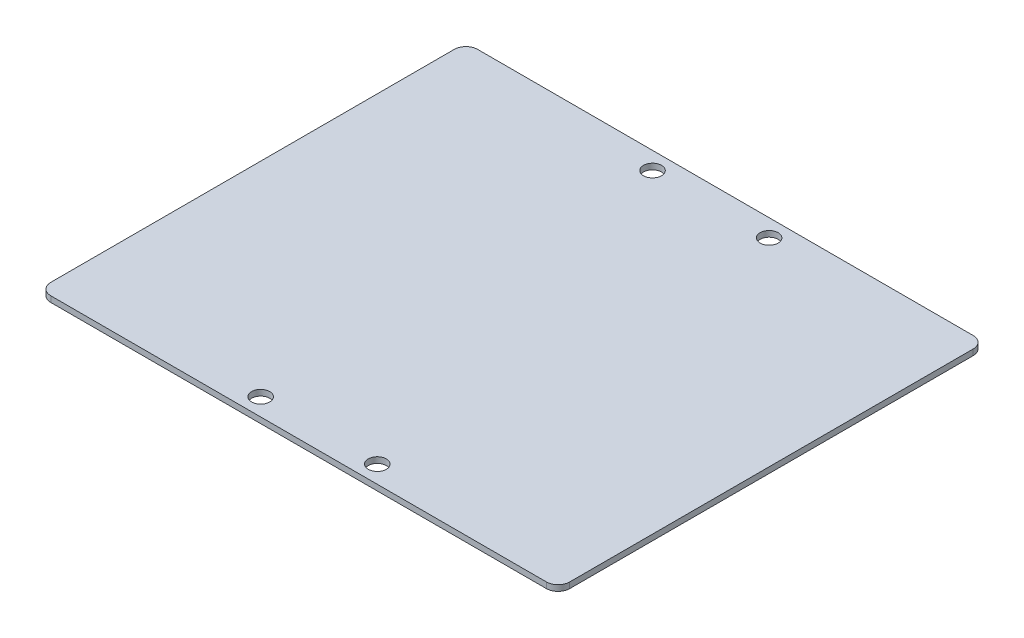
ISO-10303-21;
HEADER;
FILE_DESCRIPTION(('STEP AP214'),'2;1');
FILE_NAME('part.step','',(''),(''),'','','');
FILE_SCHEMA(('AUTOMOTIVE_DESIGN { 1 0 10303 214 1 1 1 1 }'));
ENDSEC;
DATA;
#1=APPLICATION_CONTEXT('core data for automotive mechanical design processes');
#2=APPLICATION_PROTOCOL_DEFINITION('international standard','automotive_design',2000,#1);
#3=PRODUCT_CONTEXT('',#1,'mechanical');
#4=PRODUCT('Part','Part','',(#3));
#5=PRODUCT_RELATED_PRODUCT_CATEGORY('part','',(#4));
#6=PRODUCT_DEFINITION_FORMATION('','',#4);
#7=PRODUCT_DEFINITION_CONTEXT('part definition',#1,'design');
#8=PRODUCT_DEFINITION('design','',#6,#7);
#9=PRODUCT_DEFINITION_SHAPE('','',#8);
#10=(LENGTH_UNIT() NAMED_UNIT(*) SI_UNIT(.MILLI.,.METRE.));
#11=(NAMED_UNIT(*) PLANE_ANGLE_UNIT() SI_UNIT($,.RADIAN.));
#12=(NAMED_UNIT(*) SI_UNIT($,.STERADIAN.) SOLID_ANGLE_UNIT());
#13=UNCERTAINTY_MEASURE_WITH_UNIT(LENGTH_MEASURE(1.E-05),#10,'distance_accuracy_value','');
#14=(GEOMETRIC_REPRESENTATION_CONTEXT(3) GLOBAL_UNCERTAINTY_ASSIGNED_CONTEXT((#13)) GLOBAL_UNIT_ASSIGNED_CONTEXT((#10,
#11,#12)) REPRESENTATION_CONTEXT('',''));
#15=CARTESIAN_POINT('',(0.,0.,0.));
#16=DIRECTION('',(0.,0.,1.));
#17=DIRECTION('',(1.,0.,0.));
#18=AXIS2_PLACEMENT_3D('',#15,#16,#17);
#19=CARTESIAN_POINT('',(44.5,1.,-36.6));
#20=DIRECTION('',(-1.,0.,0.));
#21=DIRECTION('',(0.,0.,1.));
#22=AXIS2_PLACEMENT_3D('',#19,#20,#21);
#23=PLANE('',#22);
#24=DIRECTION('',(0.,0.,-1.));
#25=VECTOR('',#24,1.);
#26=CARTESIAN_POINT('',(44.5,1.,-36.6));
#27=LINE('',#26,#25);
#28=CARTESIAN_POINT('',(44.5,1.,34.6));
#29=VERTEX_POINT('',#28);
#30=CARTESIAN_POINT('',(44.5,1.,-34.6));
#31=VERTEX_POINT('',#30);
#32=EDGE_CURVE('E123',#29,#31,#27,.T.);
#33=ORIENTED_EDGE('',*,*,#32,.F.);
#34=DIRECTION('',(0.,-1.,0.));
#35=VECTOR('',#34,1.);
#36=CARTESIAN_POINT('',(44.5,1.,34.6));
#37=LINE('',#36,#35);
#38=CARTESIAN_POINT('',(44.5,0.,34.6));
#39=VERTEX_POINT('',#38);
#40=EDGE_CURVE('E108',#29,#39,#37,.T.);
#41=ORIENTED_EDGE('',*,*,#40,.T.);
#42=DIRECTION('',(0.,0.,-1.));
#43=VECTOR('',#42,1.);
#44=CARTESIAN_POINT('',(44.5,0.,-36.6));
#45=LINE('',#44,#43);
#46=CARTESIAN_POINT('',(44.5,0.,-34.6));
#47=VERTEX_POINT('',#46);
#48=EDGE_CURVE('E120',#39,#47,#45,.T.);
#49=ORIENTED_EDGE('',*,*,#48,.T.);
#50=DIRECTION('',(0.,-1.,0.));
#51=VECTOR('',#50,1.);
#52=CARTESIAN_POINT('',(44.5,1.,-34.6));
#53=LINE('',#52,#51);
#54=EDGE_CURVE('E125',#47,#31,#53,.F.);
#55=ORIENTED_EDGE('',*,*,#54,.T.);
#56=EDGE_LOOP('',(#33,#41,#49,#55));
#57=FACE_BOUND('',#56,.T.);
#58=ADVANCED_FACE('F38',(#57),#23,.F.);
#59=CARTESIAN_POINT('',(-44.5,1.,-36.6));
#60=DIRECTION('',(0.,0.,1.));
#61=DIRECTION('',(1.,0.,0.));
#62=AXIS2_PLACEMENT_3D('',#59,#60,#61);
#63=PLANE('',#62);
#64=DIRECTION('',(-1.,0.,0.));
#65=VECTOR('',#64,1.);
#66=CARTESIAN_POINT('',(-44.5,0.,-36.6));
#67=LINE('',#66,#65);
#68=CARTESIAN_POINT('',(42.5,0.,-36.6));
#69=VERTEX_POINT('',#68);
#70=CARTESIAN_POINT('',(-42.5,0.,-36.6));
#71=VERTEX_POINT('',#70);
#72=EDGE_CURVE('E129',#69,#71,#67,.T.);
#73=ORIENTED_EDGE('',*,*,#72,.T.);
#74=DIRECTION('',(0.,-1.,0.));
#75=VECTOR('',#74,1.);
#76=CARTESIAN_POINT('',(-42.5,1.,-36.6));
#77=LINE('',#76,#75);
#78=CARTESIAN_POINT('',(-42.5,1.,-36.6));
#79=VERTEX_POINT('',#78);
#80=EDGE_CURVE('E11',#71,#79,#77,.F.);
#81=ORIENTED_EDGE('',*,*,#80,.T.);
#82=DIRECTION('',(-1.,0.,0.));
#83=VECTOR('',#82,1.);
#84=CARTESIAN_POINT('',(-44.5,1.,-36.6));
#85=LINE('',#84,#83);
#86=CARTESIAN_POINT('',(42.5,1.,-36.6));
#87=VERTEX_POINT('',#86);
#88=EDGE_CURVE('E169',#87,#79,#85,.T.);
#89=ORIENTED_EDGE('',*,*,#88,.F.);
#90=DIRECTION('',(0.,-1.,0.));
#91=VECTOR('',#90,1.);
#92=CARTESIAN_POINT('',(42.5,1.,-36.6));
#93=LINE('',#92,#91);
#94=EDGE_CURVE('E46',#87,#69,#93,.T.);
#95=ORIENTED_EDGE('',*,*,#94,.T.);
#96=EDGE_LOOP('',(#73,#81,#89,#95));
#97=FACE_BOUND('',#96,.T.);
#98=ADVANCED_FACE('F167',(#97),#63,.F.);
#99=CARTESIAN_POINT('',(-44.5,1.,-36.6));
#100=DIRECTION('',(1.,0.,0.));
#101=DIRECTION('',(0.,0.,-1.));
#102=AXIS2_PLACEMENT_3D('',#99,#100,#101);
#103=PLANE('',#102);
#104=DIRECTION('',(0.,0.,1.));
#105=VECTOR('',#104,1.);
#106=CARTESIAN_POINT('',(-44.5,0.,-36.6));
#107=LINE('',#106,#105);
#108=CARTESIAN_POINT('',(-44.5,0.,-34.6));
#109=VERTEX_POINT('',#108);
#110=CARTESIAN_POINT('',(-44.5,0.,34.6));
#111=VERTEX_POINT('',#110);
#112=EDGE_CURVE('E133',#109,#111,#107,.T.);
#113=ORIENTED_EDGE('',*,*,#112,.T.);
#114=DIRECTION('',(0.,-1.,0.));
#115=VECTOR('',#114,1.);
#116=CARTESIAN_POINT('',(-44.5,1.,34.6));
#117=LINE('',#116,#115);
#118=CARTESIAN_POINT('',(-44.5,1.,34.6));
#119=VERTEX_POINT('',#118);
#120=EDGE_CURVE('E53',#111,#119,#117,.F.);
#121=ORIENTED_EDGE('',*,*,#120,.T.);
#122=DIRECTION('',(0.,0.,1.));
#123=VECTOR('',#122,1.);
#124=CARTESIAN_POINT('',(-44.5,1.,-36.6));
#125=LINE('',#124,#123);
#126=CARTESIAN_POINT('',(-44.5,1.,-34.6));
#127=VERTEX_POINT('',#126);
#128=EDGE_CURVE('E177',#127,#119,#125,.T.);
#129=ORIENTED_EDGE('',*,*,#128,.F.);
#130=DIRECTION('',(0.,-1.,0.));
#131=VECTOR('',#130,1.);
#132=CARTESIAN_POINT('',(-44.5,1.,-34.6));
#133=LINE('',#132,#131);
#134=EDGE_CURVE('E160',#127,#109,#133,.T.);
#135=ORIENTED_EDGE('',*,*,#134,.T.);
#136=EDGE_LOOP('',(#113,#121,#129,#135));
#137=FACE_BOUND('',#136,.T.);
#138=ADVANCED_FACE('F176',(#137),#103,.F.);
#139=CARTESIAN_POINT('',(-44.5,1.,36.6));
#140=DIRECTION('',(0.,0.,-1.));
#141=DIRECTION('',(-1.,0.,0.));
#142=AXIS2_PLACEMENT_3D('',#139,#140,#141);
#143=PLANE('',#142);
#144=DIRECTION('',(1.,0.,0.));
#145=VECTOR('',#144,1.);
#146=CARTESIAN_POINT('',(-44.5,0.,36.6));
#147=LINE('',#146,#145);
#148=CARTESIAN_POINT('',(-42.5,0.,36.6));
#149=VERTEX_POINT('',#148);
#150=CARTESIAN_POINT('',(42.5,0.,36.6));
#151=VERTEX_POINT('',#150);
#152=EDGE_CURVE('E143',#149,#151,#147,.T.);
#153=ORIENTED_EDGE('',*,*,#152,.T.);
#154=DIRECTION('',(0.,-1.,0.));
#155=VECTOR('',#154,1.);
#156=CARTESIAN_POINT('',(42.5,1.,36.6));
#157=LINE('',#156,#155);
#158=CARTESIAN_POINT('',(42.5,1.,36.6));
#159=VERTEX_POINT('',#158);
#160=EDGE_CURVE('E109',#151,#159,#157,.F.);
#161=ORIENTED_EDGE('',*,*,#160,.T.);
#162=DIRECTION('',(1.,0.,0.));
#163=VECTOR('',#162,1.);
#164=CARTESIAN_POINT('',(-44.5,1.,36.6));
#165=LINE('',#164,#163);
#166=CARTESIAN_POINT('',(-42.5,1.,36.6));
#167=VERTEX_POINT('',#166);
#168=EDGE_CURVE('E139',#167,#159,#165,.T.);
#169=ORIENTED_EDGE('',*,*,#168,.F.);
#170=DIRECTION('',(0.,-1.,0.));
#171=VECTOR('',#170,1.);
#172=CARTESIAN_POINT('',(-42.5,1.,36.6));
#173=LINE('',#172,#171);
#174=EDGE_CURVE('E114',#167,#149,#173,.T.);
#175=ORIENTED_EDGE('',*,*,#174,.T.);
#176=EDGE_LOOP('',(#153,#161,#169,#175));
#177=FACE_BOUND('',#176,.T.);
#178=ADVANCED_FACE('F248',(#177),#143,.F.);
#179=CARTESIAN_POINT('',(0.,1.,0.));
#180=DIRECTION('',(0.,1.,0.));
#181=DIRECTION('',(0.,0.,1.));
#182=AXIS2_PLACEMENT_3D('',#179,#180,#181);
#183=PLANE('',#182);
#184=CARTESIAN_POINT('',(10.5,0.999999999999999,-33.6));
#185=DIRECTION('',(0.,1.,0.));
#186=DIRECTION('',(0.,0.,1.));
#187=AXIS2_PLACEMENT_3D('',#184,#185,#186);
#188=CIRCLE('',#187,1.55);
#189=CARTESIAN_POINT('',(10.5,0.999999999999999,-32.05));
#190=VERTEX_POINT('',#189);
#191=EDGE_CURVE('E130',#190,#190,#188,.T.);
#192=ORIENTED_EDGE('',*,*,#191,.F.);
#193=EDGE_LOOP('',(#192));
#194=FACE_BOUND('',#193,.T.);
#195=CARTESIAN_POINT('',(-9.49999999999996,0.999999999999999,-33.6));
#196=DIRECTION('',(0.,1.,0.));
#197=DIRECTION('',(0.,0.,1.));
#198=AXIS2_PLACEMENT_3D('',#195,#196,#197);
#199=CIRCLE('',#198,1.55);
#200=CARTESIAN_POINT('',(-9.49999999999996,0.999999999999999,-32.05));
#201=VERTEX_POINT('',#200);
#202=EDGE_CURVE('E136',#201,#201,#199,.T.);
#203=ORIENTED_EDGE('',*,*,#202,.F.);
#204=EDGE_LOOP('',(#203));
#205=FACE_BOUND('',#204,.T.);
#206=CARTESIAN_POINT('',(-9.49999999999995,0.999999999999999,33.5999999999997));
#207=DIRECTION('',(0.,1.,0.));
#208=DIRECTION('',(0.,0.,1.));
#209=AXIS2_PLACEMENT_3D('',#206,#207,#208);
#210=CIRCLE('',#209,1.55);
#211=CARTESIAN_POINT('',(-9.49999999999995,0.999999999999999,35.1499999999997));
#212=VERTEX_POINT('',#211);
#213=EDGE_CURVE('E185',#212,#212,#210,.T.);
#214=ORIENTED_EDGE('',*,*,#213,.F.);
#215=EDGE_LOOP('',(#214));
#216=FACE_BOUND('',#215,.T.);
#217=CARTESIAN_POINT('',(10.5000000000001,0.999999999999999,33.5999999999997));
#218=DIRECTION('',(0.,1.,0.));
#219=DIRECTION('',(0.,0.,1.));
#220=AXIS2_PLACEMENT_3D('',#217,#218,#219);
#221=CIRCLE('',#220,1.55);
#222=CARTESIAN_POINT('',(10.5000000000001,0.999999999999999,35.1499999999997));
#223=VERTEX_POINT('',#222);
#224=EDGE_CURVE('E188',#223,#223,#221,.T.);
#225=ORIENTED_EDGE('',*,*,#224,.F.);
#226=EDGE_LOOP('',(#225));
#227=FACE_BOUND('',#226,.T.);
#228=ORIENTED_EDGE('',*,*,#168,.T.);
#229=CARTESIAN_POINT('',(42.5,1.,34.6));
#230=DIRECTION('',(0.,1.,0.));
#231=DIRECTION('',(0.,0.,1.));
#232=AXIS2_PLACEMENT_3D('',#229,#230,#231);
#233=CIRCLE('',#232,2.);
#234=EDGE_CURVE('E158',#159,#29,#233,.T.);
#235=ORIENTED_EDGE('',*,*,#234,.T.);
#236=ORIENTED_EDGE('',*,*,#32,.T.);
#237=CARTESIAN_POINT('',(42.5,1.,-34.6));
#238=DIRECTION('',(0.,1.,0.));
#239=DIRECTION('',(0.,0.,1.));
#240=AXIS2_PLACEMENT_3D('',#237,#238,#239);
#241=CIRCLE('',#240,2.);
#242=EDGE_CURVE('E153',#31,#87,#241,.T.);
#243=ORIENTED_EDGE('',*,*,#242,.T.);
#244=ORIENTED_EDGE('',*,*,#88,.T.);
#245=CARTESIAN_POINT('',(-42.5,1.,-34.6));
#246=DIRECTION('',(0.,1.,0.));
#247=DIRECTION('',(0.,0.,1.));
#248=AXIS2_PLACEMENT_3D('',#245,#246,#247);
#249=CIRCLE('',#248,2.);
#250=EDGE_CURVE('E60',#79,#127,#249,.T.);
#251=ORIENTED_EDGE('',*,*,#250,.T.);
#252=ORIENTED_EDGE('',*,*,#128,.T.);
#253=CARTESIAN_POINT('',(-42.5,1.,34.6));
#254=DIRECTION('',(0.,1.,0.));
#255=DIRECTION('',(0.,0.,1.));
#256=AXIS2_PLACEMENT_3D('',#253,#254,#255);
#257=CIRCLE('',#256,2.);
#258=EDGE_CURVE('E156',#119,#167,#257,.T.);
#259=ORIENTED_EDGE('',*,*,#258,.T.);
#260=EDGE_LOOP('',(#228,#235,#236,#243,#244,#251,#252,#259));
#261=FACE_BOUND('',#260,.T.);
#262=ADVANCED_FACE('F209',(#194,#205,#216,#227,#261),#183,.T.);
#263=CARTESIAN_POINT('',(0.,0.,0.));
#264=DIRECTION('',(0.,1.,0.));
#265=DIRECTION('',(0.,0.,1.));
#266=AXIS2_PLACEMENT_3D('',#263,#264,#265);
#267=PLANE('',#266);
#268=CARTESIAN_POINT('',(10.5,0.,-33.6));
#269=DIRECTION('',(0.,-1.,0.));
#270=DIRECTION('',(0.,0.,-1.));
#271=AXIS2_PLACEMENT_3D('',#268,#269,#270);
#272=CIRCLE('',#271,1.55);
#273=CARTESIAN_POINT('',(10.5,0.,-35.15));
#274=VERTEX_POINT('',#273);
#275=EDGE_CURVE('E195',#274,#274,#272,.T.);
#276=ORIENTED_EDGE('',*,*,#275,.F.);
#277=EDGE_LOOP('',(#276));
#278=FACE_BOUND('',#277,.T.);
#279=CARTESIAN_POINT('',(-9.49999999999996,0.,-33.6));
#280=DIRECTION('',(0.,-1.,0.));
#281=DIRECTION('',(0.,0.,-1.));
#282=AXIS2_PLACEMENT_3D('',#279,#280,#281);
#283=CIRCLE('',#282,1.55);
#284=CARTESIAN_POINT('',(-9.49999999999996,0.,-35.15));
#285=VERTEX_POINT('',#284);
#286=EDGE_CURVE('E198',#285,#285,#283,.T.);
#287=ORIENTED_EDGE('',*,*,#286,.F.);
#288=EDGE_LOOP('',(#287));
#289=FACE_BOUND('',#288,.T.);
#290=CARTESIAN_POINT('',(-9.49999999999995,0.,33.5999999999997));
#291=DIRECTION('',(0.,-1.,0.));
#292=DIRECTION('',(0.,0.,-1.));
#293=AXIS2_PLACEMENT_3D('',#290,#291,#292);
#294=CIRCLE('',#293,1.55);
#295=CARTESIAN_POINT('',(-9.49999999999995,0.,32.0499999999997));
#296=VERTEX_POINT('',#295);
#297=EDGE_CURVE('E194',#296,#296,#294,.T.);
#298=ORIENTED_EDGE('',*,*,#297,.F.);
#299=EDGE_LOOP('',(#298));
#300=FACE_BOUND('',#299,.T.);
#301=CARTESIAN_POINT('',(10.5000000000001,0.,33.5999999999997));
#302=DIRECTION('',(0.,-1.,0.));
#303=DIRECTION('',(0.,0.,-1.));
#304=AXIS2_PLACEMENT_3D('',#301,#302,#303);
#305=CIRCLE('',#304,1.55);
#306=CARTESIAN_POINT('',(10.5000000000001,0.,32.0499999999997));
#307=VERTEX_POINT('',#306);
#308=EDGE_CURVE('E191',#307,#307,#305,.T.);
#309=ORIENTED_EDGE('',*,*,#308,.F.);
#310=EDGE_LOOP('',(#309));
#311=FACE_BOUND('',#310,.T.);
#312=ORIENTED_EDGE('',*,*,#48,.F.);
#313=CARTESIAN_POINT('',(42.5,0.,34.6));
#314=DIRECTION('',(0.,1.,0.));
#315=DIRECTION('',(0.,0.,1.));
#316=AXIS2_PLACEMENT_3D('',#313,#314,#315);
#317=CIRCLE('',#316,2.);
#318=EDGE_CURVE('E104',#39,#151,#317,.F.);
#319=ORIENTED_EDGE('',*,*,#318,.T.);
#320=ORIENTED_EDGE('',*,*,#152,.F.);
#321=CARTESIAN_POINT('',(-42.5,0.,34.6));
#322=DIRECTION('',(0.,1.,0.));
#323=DIRECTION('',(0.,0.,1.));
#324=AXIS2_PLACEMENT_3D('',#321,#322,#323);
#325=CIRCLE('',#324,2.);
#326=EDGE_CURVE('E115',#149,#111,#325,.F.);
#327=ORIENTED_EDGE('',*,*,#326,.T.);
#328=ORIENTED_EDGE('',*,*,#112,.F.);
#329=CARTESIAN_POINT('',(-42.5,0.,-34.6));
#330=DIRECTION('',(0.,1.,0.));
#331=DIRECTION('',(0.,0.,1.));
#332=AXIS2_PLACEMENT_3D('',#329,#330,#331);
#333=CIRCLE('',#332,2.);
#334=EDGE_CURVE('E147',#109,#71,#333,.F.);
#335=ORIENTED_EDGE('',*,*,#334,.T.);
#336=ORIENTED_EDGE('',*,*,#72,.F.);
#337=CARTESIAN_POINT('',(42.5,0.,-34.6));
#338=DIRECTION('',(0.,1.,0.));
#339=DIRECTION('',(0.,0.,1.));
#340=AXIS2_PLACEMENT_3D('',#337,#338,#339);
#341=CIRCLE('',#340,2.);
#342=EDGE_CURVE('E124',#69,#47,#341,.F.);
#343=ORIENTED_EDGE('',*,*,#342,.T.);
#344=EDGE_LOOP('',(#312,#319,#320,#327,#328,#335,#336,#343));
#345=FACE_BOUND('',#344,.T.);
#346=ADVANCED_FACE('F127',(#278,#289,#300,#311,#345),#267,.F.);
#347=CARTESIAN_POINT('',(10.5000000000001,10.,33.5999999999997));
#348=DIRECTION('',(0.,-1.,0.));
#349=DIRECTION('',(0.,0.,-1.));
#350=AXIS2_PLACEMENT_3D('',#347,#348,#349);
#351=CYLINDRICAL_SURFACE('',#350,1.55);
#352=ORIENTED_EDGE('',*,*,#224,.T.);
#353=EDGE_LOOP('',(#352));
#354=FACE_BOUND('',#353,.T.);
#355=ORIENTED_EDGE('',*,*,#308,.T.);
#356=EDGE_LOOP('',(#355));
#357=FACE_BOUND('',#356,.T.);
#358=ADVANCED_FACE('F208',(#354,#357),#351,.F.);
#359=CARTESIAN_POINT('',(-9.49999999999995,10.,33.5999999999997));
#360=DIRECTION('',(0.,-1.,0.));
#361=DIRECTION('',(0.,0.,-1.));
#362=AXIS2_PLACEMENT_3D('',#359,#360,#361);
#363=CYLINDRICAL_SURFACE('',#362,1.55);
#364=ORIENTED_EDGE('',*,*,#213,.T.);
#365=EDGE_LOOP('',(#364));
#366=FACE_BOUND('',#365,.T.);
#367=ORIENTED_EDGE('',*,*,#297,.T.);
#368=EDGE_LOOP('',(#367));
#369=FACE_BOUND('',#368,.T.);
#370=ADVANCED_FACE('F204',(#366,#369),#363,.F.);
#371=CARTESIAN_POINT('',(-9.49999999999996,10.,-33.6));
#372=DIRECTION('',(0.,-1.,0.));
#373=DIRECTION('',(0.,0.,-1.));
#374=AXIS2_PLACEMENT_3D('',#371,#372,#373);
#375=CYLINDRICAL_SURFACE('',#374,1.55);
#376=ORIENTED_EDGE('',*,*,#202,.T.);
#377=EDGE_LOOP('',(#376));
#378=FACE_BOUND('',#377,.T.);
#379=ORIENTED_EDGE('',*,*,#286,.T.);
#380=EDGE_LOOP('',(#379));
#381=FACE_BOUND('',#380,.T.);
#382=ADVANCED_FACE('F220',(#378,#381),#375,.F.);
#383=CARTESIAN_POINT('',(10.5,10.,-33.6));
#384=DIRECTION('',(0.,-1.,0.));
#385=DIRECTION('',(0.,0.,-1.));
#386=AXIS2_PLACEMENT_3D('',#383,#384,#385);
#387=CYLINDRICAL_SURFACE('',#386,1.55);
#388=ORIENTED_EDGE('',*,*,#191,.T.);
#389=EDGE_LOOP('',(#388));
#390=FACE_BOUND('',#389,.T.);
#391=ORIENTED_EDGE('',*,*,#275,.T.);
#392=EDGE_LOOP('',(#391));
#393=FACE_BOUND('',#392,.T.);
#394=ADVANCED_FACE('F236',(#390,#393),#387,.F.);
#395=CARTESIAN_POINT('',(42.5,1.,34.6));
#396=DIRECTION('',(0.,-1.,0.));
#397=DIRECTION('',(0.,0.,-1.));
#398=AXIS2_PLACEMENT_3D('',#395,#396,#397);
#399=CYLINDRICAL_SURFACE('',#398,2.);
#400=ORIENTED_EDGE('',*,*,#234,.F.);
#401=ORIENTED_EDGE('',*,*,#160,.F.);
#402=ORIENTED_EDGE('',*,*,#318,.F.);
#403=ORIENTED_EDGE('',*,*,#40,.F.);
#404=EDGE_LOOP('',(#400,#401,#402,#403));
#405=FACE_BOUND('',#404,.T.);
#406=ADVANCED_FACE('F107',(#405),#399,.T.);
#407=CARTESIAN_POINT('',(-42.5,1.,34.6));
#408=DIRECTION('',(0.,-1.,0.));
#409=DIRECTION('',(0.,0.,-1.));
#410=AXIS2_PLACEMENT_3D('',#407,#408,#409);
#411=CYLINDRICAL_SURFACE('',#410,2.);
#412=ORIENTED_EDGE('',*,*,#258,.F.);
#413=ORIENTED_EDGE('',*,*,#120,.F.);
#414=ORIENTED_EDGE('',*,*,#326,.F.);
#415=ORIENTED_EDGE('',*,*,#174,.F.);
#416=EDGE_LOOP('',(#412,#413,#414,#415));
#417=FACE_BOUND('',#416,.T.);
#418=ADVANCED_FACE('F235',(#417),#411,.T.);
#419=CARTESIAN_POINT('',(-42.5,1.,-34.6));
#420=DIRECTION('',(0.,-1.,0.));
#421=DIRECTION('',(0.,0.,-1.));
#422=AXIS2_PLACEMENT_3D('',#419,#420,#421);
#423=CYLINDRICAL_SURFACE('',#422,2.);
#424=ORIENTED_EDGE('',*,*,#250,.F.);
#425=ORIENTED_EDGE('',*,*,#80,.F.);
#426=ORIENTED_EDGE('',*,*,#334,.F.);
#427=ORIENTED_EDGE('',*,*,#134,.F.);
#428=EDGE_LOOP('',(#424,#425,#426,#427));
#429=FACE_BOUND('',#428,.T.);
#430=ADVANCED_FACE('F175',(#429),#423,.T.);
#431=CARTESIAN_POINT('',(42.5,1.,-34.6));
#432=DIRECTION('',(0.,-1.,0.));
#433=DIRECTION('',(0.,0.,-1.));
#434=AXIS2_PLACEMENT_3D('',#431,#432,#433);
#435=CYLINDRICAL_SURFACE('',#434,2.);
#436=ORIENTED_EDGE('',*,*,#242,.F.);
#437=ORIENTED_EDGE('',*,*,#54,.F.);
#438=ORIENTED_EDGE('',*,*,#342,.F.);
#439=ORIENTED_EDGE('',*,*,#94,.F.);
#440=EDGE_LOOP('',(#436,#437,#438,#439));
#441=FACE_BOUND('',#440,.T.);
#442=ADVANCED_FACE('F40',(#441),#435,.T.);
#443=CLOSED_SHELL('',(#58,#98,#138,#178,#262,#346,#358,#370,#382,#394,#406,#418,#430,#442));
#444=MANIFOLD_SOLID_BREP('B2',#443);
#445=ADVANCED_BREP_SHAPE_REPRESENTATION('',(#18,#444),#14);
#446=SHAPE_DEFINITION_REPRESENTATION(#9,#445);
ENDSEC;
END-ISO-10303-21;
